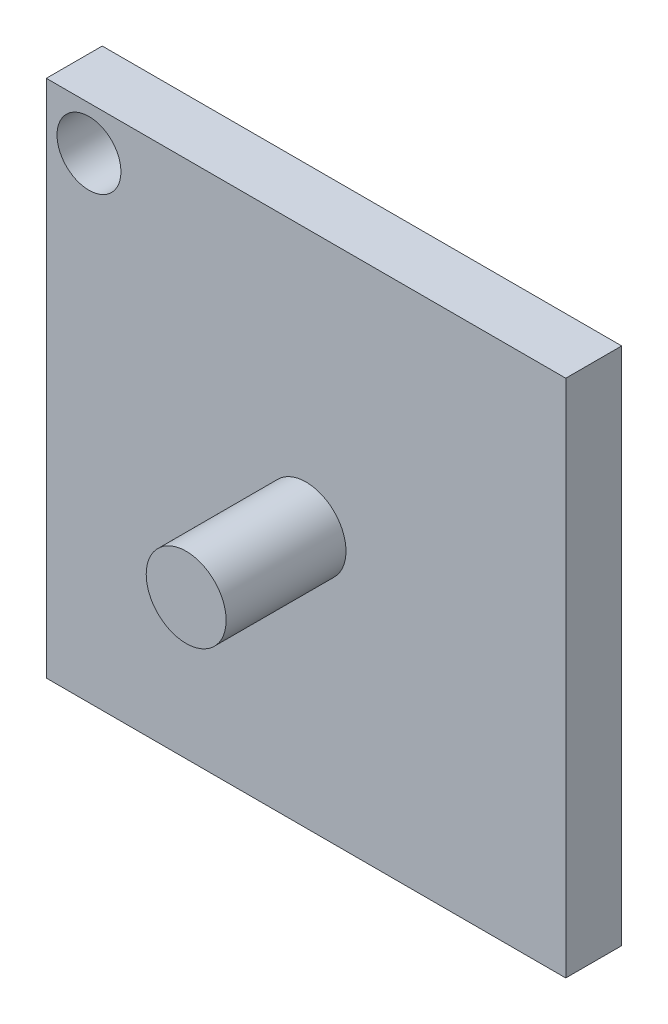
ISO-10303-21;
HEADER;
FILE_DESCRIPTION(('STEP AP214'),'2;1');
FILE_NAME('part.step','',(''),(''),'','','');
FILE_SCHEMA(('AUTOMOTIVE_DESIGN { 1 0 10303 214 1 1 1 1 }'));
ENDSEC;
DATA;
#1=APPLICATION_CONTEXT('core data for automotive mechanical design processes');
#2=APPLICATION_PROTOCOL_DEFINITION('international standard','automotive_design',2000,#1);
#3=PRODUCT_CONTEXT('',#1,'mechanical');
#4=PRODUCT('Part','Part','',(#3));
#5=PRODUCT_RELATED_PRODUCT_CATEGORY('part','',(#4));
#6=PRODUCT_DEFINITION_FORMATION('','',#4);
#7=PRODUCT_DEFINITION_CONTEXT('part definition',#1,'design');
#8=PRODUCT_DEFINITION('design','',#6,#7);
#9=PRODUCT_DEFINITION_SHAPE('','',#8);
#10=(LENGTH_UNIT() NAMED_UNIT(*) SI_UNIT(.MILLI.,.METRE.));
#11=(NAMED_UNIT(*) PLANE_ANGLE_UNIT() SI_UNIT($,.RADIAN.));
#12=(NAMED_UNIT(*) SI_UNIT($,.STERADIAN.) SOLID_ANGLE_UNIT());
#13=UNCERTAINTY_MEASURE_WITH_UNIT(LENGTH_MEASURE(1.E-05),#10,'distance_accuracy_value','');
#14=(GEOMETRIC_REPRESENTATION_CONTEXT(3) GLOBAL_UNCERTAINTY_ASSIGNED_CONTEXT((#13)) GLOBAL_UNIT_ASSIGNED_CONTEXT((#10,
#11,#12)) REPRESENTATION_CONTEXT('',''));
#15=CARTESIAN_POINT('',(0.,0.,0.));
#16=DIRECTION('',(0.,0.,1.));
#17=DIRECTION('',(1.,0.,0.));
#18=AXIS2_PLACEMENT_3D('',#15,#16,#17);
#19=CARTESIAN_POINT('',(32.5,-32.5,7.));
#20=DIRECTION('',(-1.,0.,0.));
#21=DIRECTION('',(0.,0.,1.));
#22=AXIS2_PLACEMENT_3D('',#19,#20,#21);
#23=PLANE('',#22);
#24=DIRECTION('',(0.,1.,0.));
#25=VECTOR('',#24,1.);
#26=CARTESIAN_POINT('',(32.5,-32.5,0.));
#27=LINE('',#26,#25);
#28=CARTESIAN_POINT('',(32.5,-32.5,0.));
#29=VERTEX_POINT('',#28);
#30=CARTESIAN_POINT('',(32.5,32.5,0.));
#31=VERTEX_POINT('',#30);
#32=EDGE_CURVE('E102',#29,#31,#27,.T.);
#33=ORIENTED_EDGE('',*,*,#32,.T.);
#34=DIRECTION('',(0.,0.,-1.));
#35=VECTOR('',#34,1.);
#36=CARTESIAN_POINT('',(32.5,32.5,7.));
#37=LINE('',#36,#35);
#38=CARTESIAN_POINT('',(32.5,32.5,7.));
#39=VERTEX_POINT('',#38);
#40=EDGE_CURVE('E44',#39,#31,#37,.T.);
#41=ORIENTED_EDGE('',*,*,#40,.F.);
#42=DIRECTION('',(0.,1.,0.));
#43=VECTOR('',#42,1.);
#44=CARTESIAN_POINT('',(32.5,-32.5,7.));
#45=LINE('',#44,#43);
#46=CARTESIAN_POINT('',(32.5,-32.5,7.));
#47=VERTEX_POINT('',#46);
#48=EDGE_CURVE('E88',#47,#39,#45,.T.);
#49=ORIENTED_EDGE('',*,*,#48,.F.);
#50=DIRECTION('',(0.,0.,-1.));
#51=VECTOR('',#50,1.);
#52=CARTESIAN_POINT('',(32.5,-32.5,7.));
#53=LINE('',#52,#51);
#54=EDGE_CURVE('E98',#47,#29,#53,.T.);
#55=ORIENTED_EDGE('',*,*,#54,.T.);
#56=EDGE_LOOP('',(#33,#41,#49,#55));
#57=FACE_BOUND('',#56,.T.);
#58=ADVANCED_FACE('F36',(#57),#23,.F.);
#59=CARTESIAN_POINT('',(-32.5,32.5,7.));
#60=DIRECTION('',(0.,-1.,0.));
#61=DIRECTION('',(0.,0.,-1.));
#62=AXIS2_PLACEMENT_3D('',#59,#60,#61);
#63=PLANE('',#62);
#64=DIRECTION('',(-1.,0.,0.));
#65=VECTOR('',#64,1.);
#66=CARTESIAN_POINT('',(-32.5,32.5,0.));
#67=LINE('',#66,#65);
#68=CARTESIAN_POINT('',(-32.5,32.5,0.));
#69=VERTEX_POINT('',#68);
#70=EDGE_CURVE('E93',#31,#69,#67,.T.);
#71=ORIENTED_EDGE('',*,*,#70,.T.);
#72=DIRECTION('',(0.,0.,-1.));
#73=VECTOR('',#72,1.);
#74=CARTESIAN_POINT('',(-32.5,32.5,7.));
#75=LINE('',#74,#73);
#76=CARTESIAN_POINT('',(-32.5,32.5,7.));
#77=VERTEX_POINT('',#76);
#78=EDGE_CURVE('E91',#77,#69,#75,.T.);
#79=ORIENTED_EDGE('',*,*,#78,.F.);
#80=DIRECTION('',(-1.,0.,0.));
#81=VECTOR('',#80,1.);
#82=CARTESIAN_POINT('',(-32.5,32.5,7.));
#83=LINE('',#82,#81);
#84=EDGE_CURVE('E83',#39,#77,#83,.T.);
#85=ORIENTED_EDGE('',*,*,#84,.F.);
#86=ORIENTED_EDGE('',*,*,#40,.T.);
#87=EDGE_LOOP('',(#71,#79,#85,#86));
#88=FACE_BOUND('',#87,.T.);
#89=ADVANCED_FACE('F92',(#88),#63,.F.);
#90=CARTESIAN_POINT('',(-32.5,-32.5,7.));
#91=DIRECTION('',(1.,0.,0.));
#92=DIRECTION('',(0.,0.,-1.));
#93=AXIS2_PLACEMENT_3D('',#90,#91,#92);
#94=PLANE('',#93);
#95=DIRECTION('',(0.,-1.,0.));
#96=VECTOR('',#95,1.);
#97=CARTESIAN_POINT('',(-32.5,-32.5,0.));
#98=LINE('',#97,#96);
#99=CARTESIAN_POINT('',(-32.5,-32.5,0.));
#100=VERTEX_POINT('',#99);
#101=EDGE_CURVE('E69',#69,#100,#98,.T.);
#102=ORIENTED_EDGE('',*,*,#101,.T.);
#103=DIRECTION('',(0.,0.,-1.));
#104=VECTOR('',#103,1.);
#105=CARTESIAN_POINT('',(-32.5,-32.5,7.));
#106=LINE('',#105,#104);
#107=CARTESIAN_POINT('',(-32.5,-32.5,7.));
#108=VERTEX_POINT('',#107);
#109=EDGE_CURVE('E94',#108,#100,#106,.T.);
#110=ORIENTED_EDGE('',*,*,#109,.F.);
#111=DIRECTION('',(0.,-1.,0.));
#112=VECTOR('',#111,1.);
#113=CARTESIAN_POINT('',(-32.5,-32.5,7.));
#114=LINE('',#113,#112);
#115=EDGE_CURVE('E86',#77,#108,#114,.T.);
#116=ORIENTED_EDGE('',*,*,#115,.F.);
#117=ORIENTED_EDGE('',*,*,#78,.T.);
#118=EDGE_LOOP('',(#102,#110,#116,#117));
#119=FACE_BOUND('',#118,.T.);
#120=ADVANCED_FACE('F96',(#119),#94,.F.);
#121=CARTESIAN_POINT('',(-32.5,-32.5,7.));
#122=DIRECTION('',(0.,1.,0.));
#123=DIRECTION('',(0.,0.,1.));
#124=AXIS2_PLACEMENT_3D('',#121,#122,#123);
#125=PLANE('',#124);
#126=DIRECTION('',(1.,0.,0.));
#127=VECTOR('',#126,1.);
#128=CARTESIAN_POINT('',(-32.5,-32.5,0.));
#129=LINE('',#128,#127);
#130=EDGE_CURVE('E75',#100,#29,#129,.T.);
#131=ORIENTED_EDGE('',*,*,#130,.T.);
#132=ORIENTED_EDGE('',*,*,#54,.F.);
#133=DIRECTION('',(1.,0.,0.));
#134=VECTOR('',#133,1.);
#135=CARTESIAN_POINT('',(-32.5,-32.5,7.));
#136=LINE('',#135,#134);
#137=EDGE_CURVE('E52',#108,#47,#136,.T.);
#138=ORIENTED_EDGE('',*,*,#137,.F.);
#139=ORIENTED_EDGE('',*,*,#109,.T.);
#140=EDGE_LOOP('',(#131,#132,#138,#139));
#141=FACE_BOUND('',#140,.T.);
#142=ADVANCED_FACE('F125',(#141),#125,.F.);
#143=CARTESIAN_POINT('',(0.,0.,7.));
#144=DIRECTION('',(0.,0.,-1.));
#145=DIRECTION('',(-1.,0.,0.));
#146=AXIS2_PLACEMENT_3D('',#143,#144,#145);
#147=PLANE('',#146);
#148=CARTESIAN_POINT('',(-27.1624319832036,27.0375919631078,7.));
#149=DIRECTION('',(0.,0.,1.));
#150=DIRECTION('',(1.,0.,0.));
#151=AXIS2_PLACEMENT_3D('',#148,#149,#150);
#152=CIRCLE('',#151,4.);
#153=CARTESIAN_POINT('',(-23.1624319832036,27.0375919631078,7.));
#154=VERTEX_POINT('',#153);
#155=EDGE_CURVE('E184',#154,#154,#152,.T.);
#156=ORIENTED_EDGE('',*,*,#155,.F.);
#157=EDGE_LOOP('',(#156));
#158=FACE_BOUND('',#157,.T.);
#159=CARTESIAN_POINT('',(0.,0.,7.));
#160=DIRECTION('',(0.,0.,-1.));
#161=DIRECTION('',(-1.,0.,0.));
#162=AXIS2_PLACEMENT_3D('',#159,#160,#161);
#163=CIRCLE('',#162,5.);
#164=CARTESIAN_POINT('',(-5.,0.,7.));
#165=VERTEX_POINT('',#164);
#166=EDGE_CURVE('E11',#165,#165,#163,.F.);
#167=ORIENTED_EDGE('',*,*,#166,.F.);
#168=EDGE_LOOP('',(#167));
#169=FACE_BOUND('',#168,.T.);
#170=ORIENTED_EDGE('',*,*,#48,.T.);
#171=ORIENTED_EDGE('',*,*,#84,.T.);
#172=ORIENTED_EDGE('',*,*,#115,.T.);
#173=ORIENTED_EDGE('',*,*,#137,.T.);
#174=EDGE_LOOP('',(#170,#171,#172,#173));
#175=FACE_BOUND('',#174,.T.);
#176=ADVANCED_FACE('F84',(#158,#169,#175),#147,.F.);
#177=CARTESIAN_POINT('',(0.,0.,0.));
#178=DIRECTION('',(0.,0.,-1.));
#179=DIRECTION('',(-1.,0.,0.));
#180=AXIS2_PLACEMENT_3D('',#177,#178,#179);
#181=PLANE('',#180);
#182=CARTESIAN_POINT('',(-27.1624319832036,27.0375919631078,0.));
#183=DIRECTION('',(0.,0.,1.));
#184=DIRECTION('',(1.,0.,0.));
#185=AXIS2_PLACEMENT_3D('',#182,#183,#184);
#186=CIRCLE('',#185,4.);
#187=CARTESIAN_POINT('',(-23.1624319832036,27.0375919631078,0.));
#188=VERTEX_POINT('',#187);
#189=EDGE_CURVE('E182',#188,#188,#186,.T.);
#190=ORIENTED_EDGE('',*,*,#189,.T.);
#191=EDGE_LOOP('',(#190));
#192=FACE_BOUND('',#191,.T.);
#193=ORIENTED_EDGE('',*,*,#32,.F.);
#194=ORIENTED_EDGE('',*,*,#130,.F.);
#195=ORIENTED_EDGE('',*,*,#101,.F.);
#196=ORIENTED_EDGE('',*,*,#70,.F.);
#197=EDGE_LOOP('',(#193,#194,#195,#196));
#198=FACE_BOUND('',#197,.T.);
#199=ADVANCED_FACE('F113',(#192,#198),#181,.T.);
#200=CARTESIAN_POINT('',(0.,0.,22.));
#201=DIRECTION('',(0.,0.,-1.));
#202=DIRECTION('',(-1.,0.,0.));
#203=AXIS2_PLACEMENT_3D('',#200,#201,#202);
#204=CYLINDRICAL_SURFACE('',#203,5.);
#205=CARTESIAN_POINT('',(0.,0.,22.));
#206=DIRECTION('',(0.,0.,1.));
#207=DIRECTION('',(1.,0.,0.));
#208=AXIS2_PLACEMENT_3D('',#205,#206,#207);
#209=CIRCLE('',#208,5.);
#210=CARTESIAN_POINT('',(5.,0.,22.));
#211=VERTEX_POINT('',#210);
#212=EDGE_CURVE('E105',#211,#211,#209,.T.);
#213=ORIENTED_EDGE('',*,*,#212,.F.);
#214=EDGE_LOOP('',(#213));
#215=FACE_BOUND('',#214,.T.);
#216=ORIENTED_EDGE('',*,*,#166,.T.);
#217=EDGE_LOOP('',(#216));
#218=FACE_BOUND('',#217,.T.);
#219=ADVANCED_FACE('F115',(#215,#218),#204,.T.);
#220=CARTESIAN_POINT('',(0.,0.,22.));
#221=DIRECTION('',(0.,0.,1.));
#222=DIRECTION('',(1.,0.,0.));
#223=AXIS2_PLACEMENT_3D('',#220,#221,#222);
#224=PLANE('',#223);
#225=ORIENTED_EDGE('',*,*,#212,.T.);
#226=EDGE_LOOP('',(#225));
#227=FACE_BOUND('',#226,.T.);
#228=ADVANCED_FACE('F122',(#227),#224,.T.);
#229=CARTESIAN_POINT('',(-27.1624319832036,27.0375919631078,0.));
#230=DIRECTION('',(0.,0.,1.));
#231=DIRECTION('',(1.,0.,0.));
#232=AXIS2_PLACEMENT_3D('',#229,#230,#231);
#233=CYLINDRICAL_SURFACE('',#232,4.);
#234=ORIENTED_EDGE('',*,*,#189,.F.);
#235=EDGE_LOOP('',(#234));
#236=FACE_BOUND('',#235,.T.);
#237=ORIENTED_EDGE('',*,*,#155,.T.);
#238=EDGE_LOOP('',(#237));
#239=FACE_BOUND('',#238,.T.);
#240=ADVANCED_FACE('F162',(#236,#239),#233,.F.);
#241=CLOSED_SHELL('',(#58,#89,#120,#142,#176,#199,#219,#228,#240));
#242=MANIFOLD_SOLID_BREP('B2',#241);
#243=ADVANCED_BREP_SHAPE_REPRESENTATION('',(#18,#242),#14);
#244=SHAPE_DEFINITION_REPRESENTATION(#9,#243);
ENDSEC;
END-ISO-10303-21;
